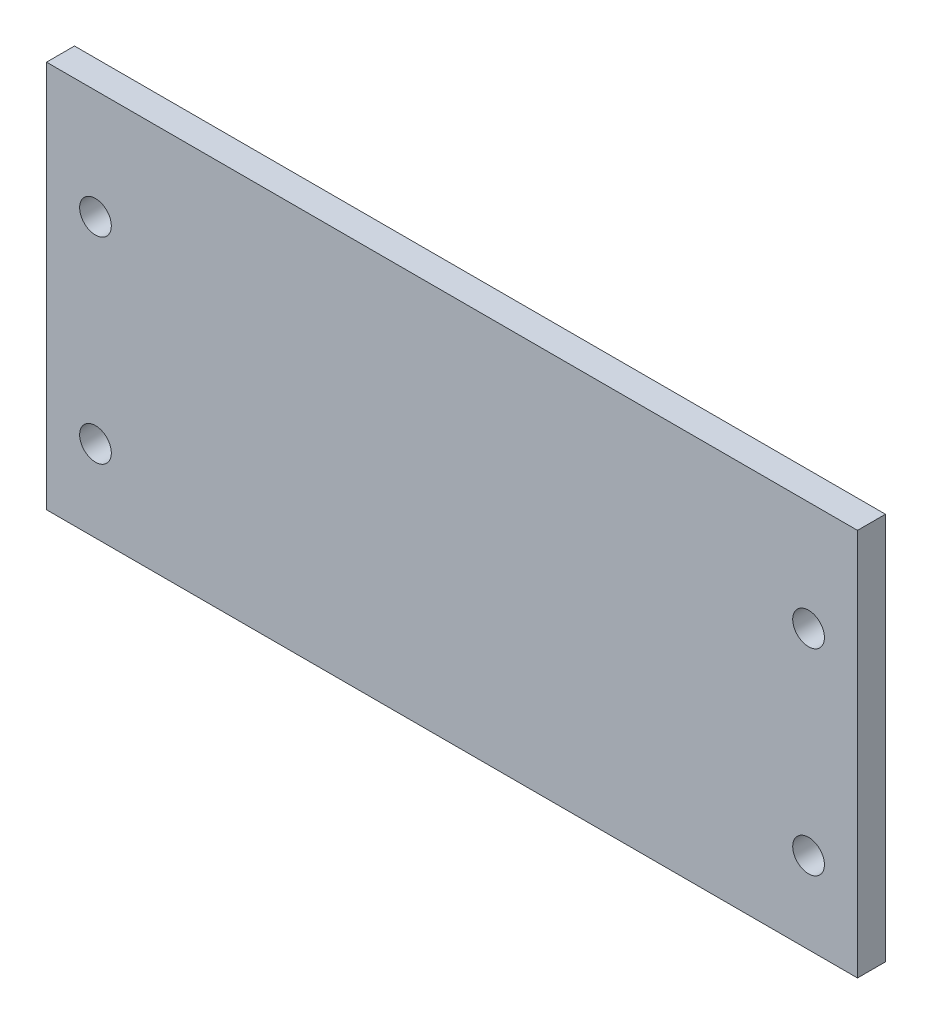
ISO-10303-21;
HEADER;
FILE_DESCRIPTION(('STEP AP214'),'2;1');
FILE_NAME('part.step','',(''),(''),'','','');
FILE_SCHEMA(('AUTOMOTIVE_DESIGN { 1 0 10303 214 1 1 1 1 }'));
ENDSEC;
DATA;
#1=APPLICATION_CONTEXT('core data for automotive mechanical design processes');
#2=APPLICATION_PROTOCOL_DEFINITION('international standard','automotive_design',2000,#1);
#3=PRODUCT_CONTEXT('',#1,'mechanical');
#4=PRODUCT('Part','Part','',(#3));
#5=PRODUCT_RELATED_PRODUCT_CATEGORY('part','',(#4));
#6=PRODUCT_DEFINITION_FORMATION('','',#4);
#7=PRODUCT_DEFINITION_CONTEXT('part definition',#1,'design');
#8=PRODUCT_DEFINITION('design','',#6,#7);
#9=PRODUCT_DEFINITION_SHAPE('','',#8);
#10=(LENGTH_UNIT() NAMED_UNIT(*) SI_UNIT(.MILLI.,.METRE.));
#11=(NAMED_UNIT(*) PLANE_ANGLE_UNIT() SI_UNIT($,.RADIAN.));
#12=(NAMED_UNIT(*) SI_UNIT($,.STERADIAN.) SOLID_ANGLE_UNIT());
#13=UNCERTAINTY_MEASURE_WITH_UNIT(LENGTH_MEASURE(1.E-05),#10,'distance_accuracy_value','');
#14=(GEOMETRIC_REPRESENTATION_CONTEXT(3) GLOBAL_UNCERTAINTY_ASSIGNED_CONTEXT((#13)) GLOBAL_UNIT_ASSIGNED_CONTEXT((#10,
#11,#12)) REPRESENTATION_CONTEXT('',''));
#15=CARTESIAN_POINT('',(0.,0.,0.));
#16=DIRECTION('',(0.,0.,1.));
#17=DIRECTION('',(1.,0.,0.));
#18=AXIS2_PLACEMENT_3D('',#15,#16,#17);
#19=CARTESIAN_POINT('',(0.,0.,3.));
#20=DIRECTION('',(0.,1.,0.));
#21=DIRECTION('',(0.,0.,1.));
#22=AXIS2_PLACEMENT_3D('',#19,#20,#21);
#23=PLANE('',#22);
#24=DIRECTION('',(1.,0.,0.));
#25=VECTOR('',#24,1.);
#26=CARTESIAN_POINT('',(0.,0.,0.));
#27=LINE('',#26,#25);
#28=CARTESIAN_POINT('',(0.,0.,0.));
#29=VERTEX_POINT('',#28);
#30=CARTESIAN_POINT('',(87.,0.,0.));
#31=VERTEX_POINT('',#30);
#32=EDGE_CURVE('E136',#29,#31,#27,.T.);
#33=ORIENTED_EDGE('',*,*,#32,.T.);
#34=DIRECTION('',(0.,0.,-1.));
#35=VECTOR('',#34,1.);
#36=CARTESIAN_POINT('',(87.,0.,3.));
#37=LINE('',#36,#35);
#38=CARTESIAN_POINT('',(87.,0.,3.));
#39=VERTEX_POINT('',#38);
#40=EDGE_CURVE('E11',#39,#31,#37,.T.);
#41=ORIENTED_EDGE('',*,*,#40,.F.);
#42=DIRECTION('',(1.,0.,0.));
#43=VECTOR('',#42,1.);
#44=CARTESIAN_POINT('',(0.,0.,3.));
#45=LINE('',#44,#43);
#46=CARTESIAN_POINT('',(0.,0.,3.));
#47=VERTEX_POINT('',#46);
#48=EDGE_CURVE('E99',#47,#39,#45,.T.);
#49=ORIENTED_EDGE('',*,*,#48,.F.);
#50=DIRECTION('',(0.,0.,-1.));
#51=VECTOR('',#50,1.);
#52=CARTESIAN_POINT('',(0.,0.,3.));
#53=LINE('',#52,#51);
#54=EDGE_CURVE('E70',#47,#29,#53,.T.);
#55=ORIENTED_EDGE('',*,*,#54,.T.);
#56=EDGE_LOOP('',(#33,#41,#49,#55));
#57=FACE_BOUND('',#56,.T.);
#58=ADVANCED_FACE('F47',(#57),#23,.F.);
#59=CARTESIAN_POINT('',(87.,0.,3.));
#60=DIRECTION('',(-1.,0.,0.));
#61=DIRECTION('',(0.,0.,1.));
#62=AXIS2_PLACEMENT_3D('',#59,#60,#61);
#63=PLANE('',#62);
#64=DIRECTION('',(0.,1.,0.));
#65=VECTOR('',#64,1.);
#66=CARTESIAN_POINT('',(87.,0.,0.));
#67=LINE('',#66,#65);
#68=CARTESIAN_POINT('',(87.,41.59,0.));
#69=VERTEX_POINT('',#68);
#70=EDGE_CURVE('E107',#31,#69,#67,.T.);
#71=ORIENTED_EDGE('',*,*,#70,.T.);
#72=DIRECTION('',(0.,0.,-1.));
#73=VECTOR('',#72,1.);
#74=CARTESIAN_POINT('',(87.,41.59,3.));
#75=LINE('',#74,#73);
#76=CARTESIAN_POINT('',(87.,41.59,3.));
#77=VERTEX_POINT('',#76);
#78=EDGE_CURVE('E56',#77,#69,#75,.T.);
#79=ORIENTED_EDGE('',*,*,#78,.F.);
#80=DIRECTION('',(0.,1.,0.));
#81=VECTOR('',#80,1.);
#82=CARTESIAN_POINT('',(87.,0.,3.));
#83=LINE('',#82,#81);
#84=EDGE_CURVE('E95',#39,#77,#83,.T.);
#85=ORIENTED_EDGE('',*,*,#84,.F.);
#86=ORIENTED_EDGE('',*,*,#40,.T.);
#87=EDGE_LOOP('',(#71,#79,#85,#86));
#88=FACE_BOUND('',#87,.T.);
#89=ADVANCED_FACE('F103',(#88),#63,.F.);
#90=CARTESIAN_POINT('',(0.,41.59,3.));
#91=DIRECTION('',(0.,1.,0.));
#92=DIRECTION('',(0.,0.,1.));
#93=AXIS2_PLACEMENT_3D('',#90,#91,#92);
#94=PLANE('',#93);
#95=DIRECTION('',(1.,0.,0.));
#96=VECTOR('',#95,1.);
#97=CARTESIAN_POINT('',(0.,41.59,0.));
#98=LINE('',#97,#96);
#99=CARTESIAN_POINT('',(0.,41.59,0.));
#100=VERTEX_POINT('',#99);
#101=EDGE_CURVE('E141',#100,#69,#98,.T.);
#102=ORIENTED_EDGE('',*,*,#101,.F.);
#103=DIRECTION('',(0.,0.,-1.));
#104=VECTOR('',#103,1.);
#105=CARTESIAN_POINT('',(0.,41.59,3.));
#106=LINE('',#105,#104);
#107=CARTESIAN_POINT('',(0.,41.59,3.));
#108=VERTEX_POINT('',#107);
#109=EDGE_CURVE('E83',#108,#100,#106,.T.);
#110=ORIENTED_EDGE('',*,*,#109,.F.);
#111=DIRECTION('',(1.,0.,0.));
#112=VECTOR('',#111,1.);
#113=CARTESIAN_POINT('',(0.,41.59,3.));
#114=LINE('',#113,#112);
#115=EDGE_CURVE('E98',#108,#77,#114,.T.);
#116=ORIENTED_EDGE('',*,*,#115,.T.);
#117=ORIENTED_EDGE('',*,*,#78,.T.);
#118=EDGE_LOOP('',(#102,#110,#116,#117));
#119=FACE_BOUND('',#118,.T.);
#120=ADVANCED_FACE('F108',(#119),#94,.T.);
#121=CARTESIAN_POINT('',(5.25,29.85,3.));
#122=DIRECTION('',(0.,0.,-1.));
#123=DIRECTION('',(-1.,0.,0.));
#124=AXIS2_PLACEMENT_3D('',#121,#122,#123);
#125=CYLINDRICAL_SURFACE('',#124,1.7);
#126=CARTESIAN_POINT('',(5.25,29.85,3.));
#127=DIRECTION('',(0.,0.,1.));
#128=DIRECTION('',(1.,0.,0.));
#129=AXIS2_PLACEMENT_3D('',#126,#127,#128);
#130=CIRCLE('',#129,1.7);
#131=CARTESIAN_POINT('',(6.95,29.85,3.));
#132=VERTEX_POINT('',#131);
#133=EDGE_CURVE('E156',#132,#132,#130,.T.);
#134=ORIENTED_EDGE('',*,*,#133,.T.);
#135=EDGE_LOOP('',(#134));
#136=FACE_BOUND('',#135,.T.);
#137=CARTESIAN_POINT('',(5.25,29.85,0.));
#138=DIRECTION('',(0.,0.,1.));
#139=DIRECTION('',(1.,0.,0.));
#140=AXIS2_PLACEMENT_3D('',#137,#138,#139);
#141=CIRCLE('',#140,1.7);
#142=CARTESIAN_POINT('',(6.95,29.85,0.));
#143=VERTEX_POINT('',#142);
#144=EDGE_CURVE('E133',#143,#143,#141,.T.);
#145=ORIENTED_EDGE('',*,*,#144,.F.);
#146=EDGE_LOOP('',(#145));
#147=FACE_BOUND('',#146,.T.);
#148=ADVANCED_FACE('F203',(#136,#147),#125,.F.);
#149=CARTESIAN_POINT('',(5.25,8.75,3.));
#150=DIRECTION('',(0.,0.,-1.));
#151=DIRECTION('',(-1.,0.,0.));
#152=AXIS2_PLACEMENT_3D('',#149,#150,#151);
#153=CYLINDRICAL_SURFACE('',#152,1.7);
#154=CARTESIAN_POINT('',(5.25,8.75,3.));
#155=DIRECTION('',(0.,0.,1.));
#156=DIRECTION('',(1.,0.,0.));
#157=AXIS2_PLACEMENT_3D('',#154,#155,#156);
#158=CIRCLE('',#157,1.7);
#159=CARTESIAN_POINT('',(6.95,8.75,3.));
#160=VERTEX_POINT('',#159);
#161=EDGE_CURVE('E180',#160,#160,#158,.T.);
#162=ORIENTED_EDGE('',*,*,#161,.T.);
#163=EDGE_LOOP('',(#162));
#164=FACE_BOUND('',#163,.T.);
#165=CARTESIAN_POINT('',(5.25,8.75,0.));
#166=DIRECTION('',(0.,0.,1.));
#167=DIRECTION('',(1.,0.,0.));
#168=AXIS2_PLACEMENT_3D('',#165,#166,#167);
#169=CIRCLE('',#168,1.7);
#170=CARTESIAN_POINT('',(6.95,8.75,0.));
#171=VERTEX_POINT('',#170);
#172=EDGE_CURVE('E129',#171,#171,#169,.T.);
#173=ORIENTED_EDGE('',*,*,#172,.F.);
#174=EDGE_LOOP('',(#173));
#175=FACE_BOUND('',#174,.T.);
#176=ADVANCED_FACE('F205',(#164,#175),#153,.F.);
#177=CARTESIAN_POINT('',(81.75,8.75,3.));
#178=DIRECTION('',(0.,0.,-1.));
#179=DIRECTION('',(-1.,0.,0.));
#180=AXIS2_PLACEMENT_3D('',#177,#178,#179);
#181=CYLINDRICAL_SURFACE('',#180,1.70000000000001);
#182=CARTESIAN_POINT('',(81.75,8.75,3.));
#183=DIRECTION('',(0.,0.,1.));
#184=DIRECTION('',(1.,0.,0.));
#185=AXIS2_PLACEMENT_3D('',#182,#183,#184);
#186=CIRCLE('',#185,1.70000000000001);
#187=CARTESIAN_POINT('',(83.45,8.75,3.));
#188=VERTEX_POINT('',#187);
#189=EDGE_CURVE('E163',#188,#188,#186,.T.);
#190=ORIENTED_EDGE('',*,*,#189,.T.);
#191=EDGE_LOOP('',(#190));
#192=FACE_BOUND('',#191,.T.);
#193=CARTESIAN_POINT('',(81.75,8.75,0.));
#194=DIRECTION('',(0.,0.,1.));
#195=DIRECTION('',(1.,0.,0.));
#196=AXIS2_PLACEMENT_3D('',#193,#194,#195);
#197=CIRCLE('',#196,1.70000000000001);
#198=CARTESIAN_POINT('',(83.45,8.75,0.));
#199=VERTEX_POINT('',#198);
#200=EDGE_CURVE('E124',#199,#199,#197,.T.);
#201=ORIENTED_EDGE('',*,*,#200,.F.);
#202=EDGE_LOOP('',(#201));
#203=FACE_BOUND('',#202,.T.);
#204=ADVANCED_FACE('F189',(#192,#203),#181,.F.);
#205=CARTESIAN_POINT('',(81.75,29.85,3.));
#206=DIRECTION('',(0.,0.,-1.));
#207=DIRECTION('',(-1.,0.,0.));
#208=AXIS2_PLACEMENT_3D('',#205,#206,#207);
#209=CYLINDRICAL_SURFACE('',#208,1.7);
#210=CARTESIAN_POINT('',(81.75,29.85,3.));
#211=DIRECTION('',(0.,0.,1.));
#212=DIRECTION('',(1.,0.,0.));
#213=AXIS2_PLACEMENT_3D('',#210,#211,#212);
#214=CIRCLE('',#213,1.7);
#215=CARTESIAN_POINT('',(83.45,29.85,3.));
#216=VERTEX_POINT('',#215);
#217=EDGE_CURVE('E149',#216,#216,#214,.T.);
#218=ORIENTED_EDGE('',*,*,#217,.T.);
#219=EDGE_LOOP('',(#218));
#220=FACE_BOUND('',#219,.T.);
#221=CARTESIAN_POINT('',(81.75,29.85,0.));
#222=DIRECTION('',(0.,0.,1.));
#223=DIRECTION('',(1.,0.,0.));
#224=AXIS2_PLACEMENT_3D('',#221,#222,#223);
#225=CIRCLE('',#224,1.7);
#226=CARTESIAN_POINT('',(83.45,29.85,0.));
#227=VERTEX_POINT('',#226);
#228=EDGE_CURVE('E123',#227,#227,#225,.T.);
#229=ORIENTED_EDGE('',*,*,#228,.F.);
#230=EDGE_LOOP('',(#229));
#231=FACE_BOUND('',#230,.T.);
#232=ADVANCED_FACE('F51',(#220,#231),#209,.F.);
#233=CARTESIAN_POINT('',(0.,0.,3.));
#234=DIRECTION('',(-1.,0.,0.));
#235=DIRECTION('',(0.,0.,1.));
#236=AXIS2_PLACEMENT_3D('',#233,#234,#235);
#237=PLANE('',#236);
#238=DIRECTION('',(0.,1.,0.));
#239=VECTOR('',#238,1.);
#240=CARTESIAN_POINT('',(0.,0.,0.));
#241=LINE('',#240,#239);
#242=EDGE_CURVE('E143',#29,#100,#241,.T.);
#243=ORIENTED_EDGE('',*,*,#242,.F.);
#244=ORIENTED_EDGE('',*,*,#54,.F.);
#245=DIRECTION('',(0.,1.,0.));
#246=VECTOR('',#245,1.);
#247=CARTESIAN_POINT('',(0.,0.,3.));
#248=LINE('',#247,#246);
#249=EDGE_CURVE('E115',#47,#108,#248,.T.);
#250=ORIENTED_EDGE('',*,*,#249,.T.);
#251=ORIENTED_EDGE('',*,*,#109,.T.);
#252=EDGE_LOOP('',(#243,#244,#250,#251));
#253=FACE_BOUND('',#252,.T.);
#254=ADVANCED_FACE('F197',(#253),#237,.T.);
#255=CARTESIAN_POINT('',(0.,0.,3.));
#256=DIRECTION('',(0.,0.,1.));
#257=DIRECTION('',(1.,0.,0.));
#258=AXIS2_PLACEMENT_3D('',#255,#256,#257);
#259=PLANE('',#258);
#260=ORIENTED_EDGE('',*,*,#217,.F.);
#261=EDGE_LOOP('',(#260));
#262=FACE_BOUND('',#261,.T.);
#263=ORIENTED_EDGE('',*,*,#189,.F.);
#264=EDGE_LOOP('',(#263));
#265=FACE_BOUND('',#264,.T.);
#266=ORIENTED_EDGE('',*,*,#161,.F.);
#267=EDGE_LOOP('',(#266));
#268=FACE_BOUND('',#267,.T.);
#269=ORIENTED_EDGE('',*,*,#133,.F.);
#270=EDGE_LOOP('',(#269));
#271=FACE_BOUND('',#270,.T.);
#272=ORIENTED_EDGE('',*,*,#48,.T.);
#273=ORIENTED_EDGE('',*,*,#84,.T.);
#274=ORIENTED_EDGE('',*,*,#115,.F.);
#275=ORIENTED_EDGE('',*,*,#249,.F.);
#276=EDGE_LOOP('',(#272,#273,#274,#275));
#277=FACE_BOUND('',#276,.T.);
#278=ADVANCED_FACE('F96',(#262,#265,#268,#271,#277),#259,.T.);
#279=CARTESIAN_POINT('',(0.,0.,0.));
#280=DIRECTION('',(0.,0.,1.));
#281=DIRECTION('',(1.,0.,0.));
#282=AXIS2_PLACEMENT_3D('',#279,#280,#281);
#283=PLANE('',#282);
#284=ORIENTED_EDGE('',*,*,#228,.T.);
#285=EDGE_LOOP('',(#284));
#286=FACE_BOUND('',#285,.T.);
#287=ORIENTED_EDGE('',*,*,#200,.T.);
#288=EDGE_LOOP('',(#287));
#289=FACE_BOUND('',#288,.T.);
#290=ORIENTED_EDGE('',*,*,#172,.T.);
#291=EDGE_LOOP('',(#290));
#292=FACE_BOUND('',#291,.T.);
#293=ORIENTED_EDGE('',*,*,#144,.T.);
#294=EDGE_LOOP('',(#293));
#295=FACE_BOUND('',#294,.T.);
#296=ORIENTED_EDGE('',*,*,#32,.F.);
#297=ORIENTED_EDGE('',*,*,#242,.T.);
#298=ORIENTED_EDGE('',*,*,#101,.T.);
#299=ORIENTED_EDGE('',*,*,#70,.F.);
#300=EDGE_LOOP('',(#296,#297,#298,#299));
#301=FACE_BOUND('',#300,.T.);
#302=ADVANCED_FACE('F193',(#286,#289,#292,#295,#301),#283,.F.);
#303=CLOSED_SHELL('',(#58,#89,#120,#148,#176,#204,#232,#254,#278,#302));
#304=MANIFOLD_SOLID_BREP('B2',#303);
#305=ADVANCED_BREP_SHAPE_REPRESENTATION('',(#18,#304),#14);
#306=SHAPE_DEFINITION_REPRESENTATION(#9,#305);
ENDSEC;
END-ISO-10303-21;
